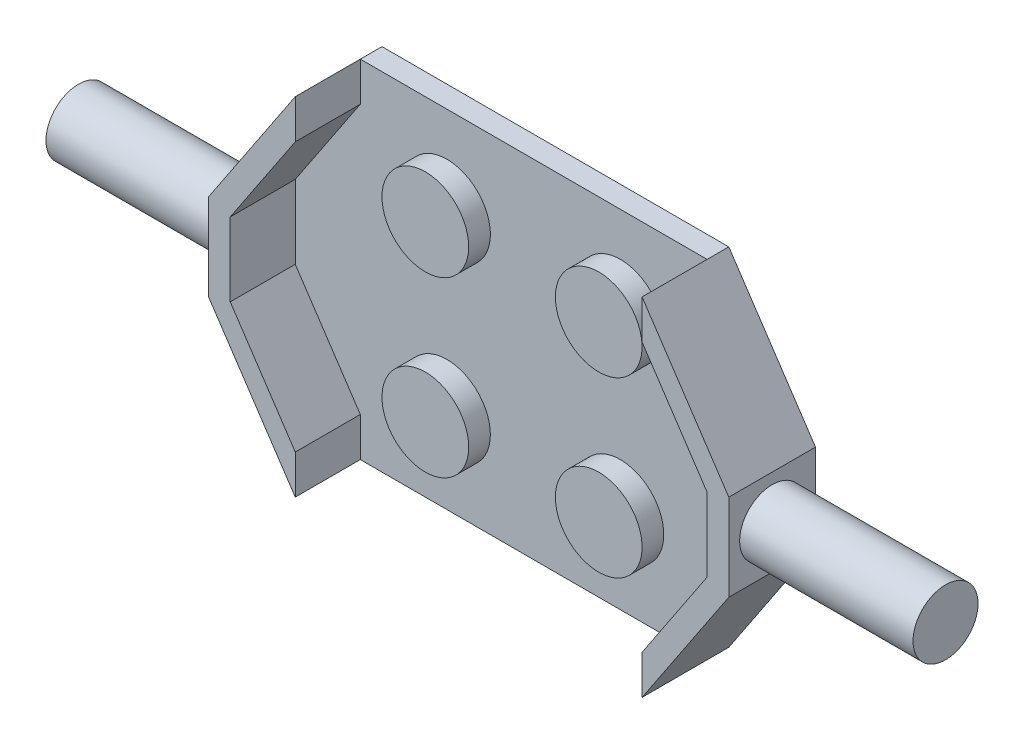
ISO-10303-21;
HEADER;
FILE_DESCRIPTION(('STEP AP214'),'2;1');
FILE_NAME('part.step','',(''),(''),'','','');
FILE_SCHEMA(('AUTOMOTIVE_DESIGN { 1 0 10303 214 1 1 1 1 }'));
ENDSEC;
DATA;
#1=APPLICATION_CONTEXT('core data for automotive mechanical design processes');
#2=APPLICATION_PROTOCOL_DEFINITION('international standard','automotive_design',2000,#1);
#3=PRODUCT_CONTEXT('',#1,'mechanical');
#4=PRODUCT('Part','Part','',(#3));
#5=PRODUCT_RELATED_PRODUCT_CATEGORY('part','',(#4));
#6=PRODUCT_DEFINITION_FORMATION('','',#4);
#7=PRODUCT_DEFINITION_CONTEXT('part definition',#1,'design');
#8=PRODUCT_DEFINITION('design','',#6,#7);
#9=PRODUCT_DEFINITION_SHAPE('','',#8);
#10=(LENGTH_UNIT() NAMED_UNIT(*) SI_UNIT(.MILLI.,.METRE.));
#11=(NAMED_UNIT(*) PLANE_ANGLE_UNIT() SI_UNIT($,.RADIAN.));
#12=(NAMED_UNIT(*) SI_UNIT($,.STERADIAN.) SOLID_ANGLE_UNIT());
#13=UNCERTAINTY_MEASURE_WITH_UNIT(LENGTH_MEASURE(1.E-05),#10,'distance_accuracy_value','');
#14=(GEOMETRIC_REPRESENTATION_CONTEXT(3) GLOBAL_UNCERTAINTY_ASSIGNED_CONTEXT((#13)) GLOBAL_UNIT_ASSIGNED_CONTEXT((#10,
#11,#12)) REPRESENTATION_CONTEXT('',''));
#15=CARTESIAN_POINT('',(0.,0.,0.));
#16=DIRECTION('',(0.,0.,1.));
#17=DIRECTION('',(1.,0.,0.));
#18=AXIS2_PLACEMENT_3D('',#15,#16,#17);
#19=CARTESIAN_POINT('',(0.,0.,1.));
#20=DIRECTION('',(0.,0.,-1.));
#21=DIRECTION('',(-1.,0.,0.));
#22=AXIS2_PLACEMENT_3D('',#19,#20,#21);
#23=PLANE('',#22);
#24=CARTESIAN_POINT('',(4.,4.,1.));
#25=DIRECTION('',(0.,0.,-1.));
#26=DIRECTION('',(-1.,0.,0.));
#27=AXIS2_PLACEMENT_3D('',#24,#25,#26);
#28=CIRCLE('',#27,2.);
#29=CARTESIAN_POINT('',(2.,4.,1.));
#30=VERTEX_POINT('',#29);
#31=EDGE_CURVE('E230',#30,#30,#28,.T.);
#32=ORIENTED_EDGE('',*,*,#31,.T.);
#33=EDGE_LOOP('',(#32));
#34=FACE_BOUND('',#33,.T.);
#35=CARTESIAN_POINT('',(3.99999999999999,-4.,1.));
#36=DIRECTION('',(0.,0.,-1.));
#37=DIRECTION('',(-1.,0.,0.));
#38=AXIS2_PLACEMENT_3D('',#35,#36,#37);
#39=CIRCLE('',#38,2.);
#40=CARTESIAN_POINT('',(2.,-4.,1.));
#41=VERTEX_POINT('',#40);
#42=EDGE_CURVE('E43',#41,#41,#39,.F.);
#43=ORIENTED_EDGE('',*,*,#42,.F.);
#44=EDGE_LOOP('',(#43));
#45=FACE_BOUND('',#44,.T.);
#46=CARTESIAN_POINT('',(-3.99999999999999,-4.,1.));
#47=DIRECTION('',(0.,0.,1.));
#48=DIRECTION('',(1.,0.,0.));
#49=AXIS2_PLACEMENT_3D('',#46,#47,#48);
#50=CIRCLE('',#49,2.);
#51=CARTESIAN_POINT('',(-2.,-4.,1.));
#52=VERTEX_POINT('',#51);
#53=EDGE_CURVE('E303',#52,#52,#50,.F.);
#54=ORIENTED_EDGE('',*,*,#53,.T.);
#55=EDGE_LOOP('',(#54));
#56=FACE_BOUND('',#55,.T.);
#57=CARTESIAN_POINT('',(-4.,4.,1.));
#58=DIRECTION('',(0.,0.,-1.));
#59=DIRECTION('',(-1.,0.,0.));
#60=AXIS2_PLACEMENT_3D('',#57,#58,#59);
#61=CIRCLE('',#60,2.);
#62=CARTESIAN_POINT('',(-6.,4.,1.));
#63=VERTEX_POINT('',#62);
#64=EDGE_CURVE('E336',#63,#63,#61,.F.);
#65=ORIENTED_EDGE('',*,*,#64,.F.);
#66=EDGE_LOOP('',(#65));
#67=FACE_BOUND('',#66,.T.);
#68=DIRECTION('',(-0.554700196225229,0.832050294337844,0.));
#69=VECTOR('',#68,1.);
#70=CARTESIAN_POINT('',(8.,6.197224362268,1.));
#71=LINE('',#70,#69);
#72=CARTESIAN_POINT('',(11.,1.697224362268,1.));
#73=VERTEX_POINT('',#72);
#74=CARTESIAN_POINT('',(8.,6.197224362268,1.));
#75=VERTEX_POINT('',#74);
#76=EDGE_CURVE('E208',#73,#75,#71,.T.);
#77=ORIENTED_EDGE('',*,*,#76,.T.);
#78=DIRECTION('',(0.,1.,0.));
#79=VECTOR('',#78,1.);
#80=CARTESIAN_POINT('',(8.,8.,1.));
#81=LINE('',#80,#79);
#82=CARTESIAN_POINT('',(8.,8.,1.));
#83=VERTEX_POINT('',#82);
#84=EDGE_CURVE('E205',#75,#83,#81,.T.);
#85=ORIENTED_EDGE('',*,*,#84,.T.);
#86=DIRECTION('',(-1.,0.,0.));
#87=VECTOR('',#86,1.);
#88=CARTESIAN_POINT('',(0.,8.,1.));
#89=LINE('',#88,#87);
#90=CARTESIAN_POINT('',(-8.,8.,1.));
#91=VERTEX_POINT('',#90);
#92=EDGE_CURVE('E310',#83,#91,#89,.T.);
#93=ORIENTED_EDGE('',*,*,#92,.T.);
#94=DIRECTION('',(0.,1.,0.));
#95=VECTOR('',#94,1.);
#96=CARTESIAN_POINT('',(-8.,8.,1.));
#97=LINE('',#96,#95);
#98=CARTESIAN_POINT('',(-8.,6.197224362268,1.));
#99=VERTEX_POINT('',#98);
#100=EDGE_CURVE('E259',#99,#91,#97,.T.);
#101=ORIENTED_EDGE('',*,*,#100,.F.);
#102=DIRECTION('',(0.554700196225229,0.832050294337844,0.));
#103=VECTOR('',#102,1.);
#104=CARTESIAN_POINT('',(-8.,6.197224362268,1.));
#105=LINE('',#104,#103);
#106=CARTESIAN_POINT('',(-11.,1.697224362268,1.));
#107=VERTEX_POINT('',#106);
#108=EDGE_CURVE('E278',#107,#99,#105,.T.);
#109=ORIENTED_EDGE('',*,*,#108,.F.);
#110=DIRECTION('',(0.,1.,0.));
#111=VECTOR('',#110,1.);
#112=CARTESIAN_POINT('',(-11.,1.697224362268,1.));
#113=LINE('',#112,#111);
#114=CARTESIAN_POINT('',(-11.,-1.69722436226801,1.));
#115=VERTEX_POINT('',#114);
#116=EDGE_CURVE('E55',#115,#107,#113,.T.);
#117=ORIENTED_EDGE('',*,*,#116,.F.);
#118=DIRECTION('',(-0.554700196225229,0.832050294337844,0.));
#119=VECTOR('',#118,1.);
#120=CARTESIAN_POINT('',(-11.,-1.69722436226801,1.));
#121=LINE('',#120,#119);
#122=CARTESIAN_POINT('',(-7.99999999999999,-6.19722436226801,1.));
#123=VERTEX_POINT('',#122);
#124=EDGE_CURVE('E50',#123,#115,#121,.T.);
#125=ORIENTED_EDGE('',*,*,#124,.F.);
#126=DIRECTION('',(0.,1.,0.));
#127=VECTOR('',#126,1.);
#128=CARTESIAN_POINT('',(-8.,-6.19722436226801,1.));
#129=LINE('',#128,#127);
#130=CARTESIAN_POINT('',(-8.,-8.,1.));
#131=VERTEX_POINT('',#130);
#132=EDGE_CURVE('E254',#131,#123,#129,.T.);
#133=ORIENTED_EDGE('',*,*,#132,.F.);
#134=DIRECTION('',(1.,0.,0.));
#135=VECTOR('',#134,1.);
#136=CARTESIAN_POINT('',(0.,-8.,1.));
#137=LINE('',#136,#135);
#138=CARTESIAN_POINT('',(8.,-8.,1.));
#139=VERTEX_POINT('',#138);
#140=EDGE_CURVE('E312',#131,#139,#137,.T.);
#141=ORIENTED_EDGE('',*,*,#140,.T.);
#142=DIRECTION('',(0.,1.,0.));
#143=VECTOR('',#142,1.);
#144=CARTESIAN_POINT('',(8.,-6.19722436226801,1.));
#145=LINE('',#144,#143);
#146=CARTESIAN_POINT('',(8.,-6.19722436226801,1.));
#147=VERTEX_POINT('',#146);
#148=EDGE_CURVE('E181',#139,#147,#145,.T.);
#149=ORIENTED_EDGE('',*,*,#148,.T.);
#150=DIRECTION('',(0.554700196225229,0.832050294337844,0.));
#151=VECTOR('',#150,1.);
#152=CARTESIAN_POINT('',(11.,-1.69722436226801,1.));
#153=LINE('',#152,#151);
#154=CARTESIAN_POINT('',(11.,-1.69722436226801,1.));
#155=VERTEX_POINT('',#154);
#156=EDGE_CURVE('E215',#147,#155,#153,.T.);
#157=ORIENTED_EDGE('',*,*,#156,.T.);
#158=DIRECTION('',(0.,1.,0.));
#159=VECTOR('',#158,1.);
#160=CARTESIAN_POINT('',(11.,1.697224362268,1.));
#161=LINE('',#160,#159);
#162=EDGE_CURVE('E212',#155,#73,#161,.T.);
#163=ORIENTED_EDGE('',*,*,#162,.T.);
#164=EDGE_LOOP('',(#77,#85,#93,#101,#109,#117,#125,#133,#141,#149,#157,#163));
#165=FACE_BOUND('',#164,.T.);
#166=ADVANCED_FACE('F35',(#34,#45,#56,#67,#165),#23,.F.);
#167=CARTESIAN_POINT('',(0.,8.,1.));
#168=DIRECTION('',(0.,-1.,0.));
#169=DIRECTION('',(1.,0.,0.));
#170=AXIS2_PLACEMENT_3D('',#167,#168,#169);
#171=PLANE('',#170);
#172=DIRECTION('',(-1.,0.,0.));
#173=VECTOR('',#172,1.);
#174=CARTESIAN_POINT('',(0.,8.,0.));
#175=LINE('',#174,#173);
#176=CARTESIAN_POINT('',(8.,8.,0.));
#177=VERTEX_POINT('',#176);
#178=CARTESIAN_POINT('',(-8.,8.,0.));
#179=VERTEX_POINT('',#178);
#180=EDGE_CURVE('E307',#177,#179,#175,.T.);
#181=ORIENTED_EDGE('',*,*,#180,.T.);
#182=DIRECTION('',(0.,0.,-1.));
#183=VECTOR('',#182,1.);
#184=CARTESIAN_POINT('',(-8.,8.,1.));
#185=LINE('',#184,#183);
#186=EDGE_CURVE('E333',#91,#179,#185,.T.);
#187=ORIENTED_EDGE('',*,*,#186,.F.);
#188=ORIENTED_EDGE('',*,*,#92,.F.);
#189=DIRECTION('',(0.,0.,-1.));
#190=VECTOR('',#189,1.);
#191=CARTESIAN_POINT('',(8.,8.,1.));
#192=LINE('',#191,#190);
#193=EDGE_CURVE('E170',#83,#177,#192,.T.);
#194=ORIENTED_EDGE('',*,*,#193,.T.);
#195=EDGE_LOOP('',(#181,#187,#188,#194));
#196=FACE_BOUND('',#195,.T.);
#197=ADVANCED_FACE('F37',(#196),#171,.F.);
#198=CARTESIAN_POINT('',(-8.,8.,1.));
#199=DIRECTION('',(0.832050294337844,-0.554700196225229,0.));
#200=DIRECTION('',(0.554700196225229,0.832050294337844,0.));
#201=AXIS2_PLACEMENT_3D('',#198,#199,#200);
#202=PLANE('',#201);
#203=DIRECTION('',(-0.554700196225229,-0.832050294337844,0.));
#204=VECTOR('',#203,1.);
#205=CARTESIAN_POINT('',(-8.,8.,0.));
#206=LINE('',#205,#204);
#207=CARTESIAN_POINT('',(-12.,2.,0.));
#208=VERTEX_POINT('',#207);
#209=EDGE_CURVE('E318',#179,#208,#206,.T.);
#210=ORIENTED_EDGE('',*,*,#209,.T.);
#211=DIRECTION('',(0.,0.,-1.));
#212=VECTOR('',#211,1.);
#213=CARTESIAN_POINT('',(-12.,2.,1.));
#214=LINE('',#213,#212);
#215=CARTESIAN_POINT('',(-12.,2.,4.));
#216=VERTEX_POINT('',#215);
#217=EDGE_CURVE('E330',#216,#208,#214,.T.);
#218=ORIENTED_EDGE('',*,*,#217,.F.);
#219=DIRECTION('',(-0.554700196225229,-0.832050294337844,0.));
#220=VECTOR('',#219,1.);
#221=CARTESIAN_POINT('',(-8.,8.,4.));
#222=LINE('',#221,#220);
#223=CARTESIAN_POINT('',(-8.,8.,4.));
#224=VERTEX_POINT('',#223);
#225=EDGE_CURVE('E271',#224,#216,#222,.T.);
#226=ORIENTED_EDGE('',*,*,#225,.F.);
#227=DIRECTION('',(0.,0.,-1.));
#228=VECTOR('',#227,1.);
#229=CARTESIAN_POINT('',(-8.,8.,4.));
#230=LINE('',#229,#228);
#231=EDGE_CURVE('E274',#224,#91,#230,.T.);
#232=ORIENTED_EDGE('',*,*,#231,.T.);
#233=ORIENTED_EDGE('',*,*,#186,.T.);
#234=EDGE_LOOP('',(#210,#218,#226,#232,#233));
#235=FACE_BOUND('',#234,.T.);
#236=ADVANCED_FACE('F419',(#235),#202,.F.);
#237=CARTESIAN_POINT('',(-12.,-2.,1.));
#238=DIRECTION('',(1.,0.,0.));
#239=DIRECTION('',(0.,0.,-1.));
#240=AXIS2_PLACEMENT_3D('',#237,#238,#239);
#241=PLANE('',#240);
#242=CARTESIAN_POINT('',(-12.,0.,2.));
#243=DIRECTION('',(1.,0.,0.));
#244=DIRECTION('',(0.,0.,-1.));
#245=AXIS2_PLACEMENT_3D('',#242,#243,#244);
#246=CIRCLE('',#245,1.5);
#247=CARTESIAN_POINT('',(-12.,0.,0.5));
#248=VERTEX_POINT('',#247);
#249=EDGE_CURVE('E339',#248,#248,#246,.F.);
#250=ORIENTED_EDGE('',*,*,#249,.F.);
#251=EDGE_LOOP('',(#250));
#252=FACE_BOUND('',#251,.T.);
#253=DIRECTION('',(0.,-1.,0.));
#254=VECTOR('',#253,1.);
#255=CARTESIAN_POINT('',(-12.,-2.,0.));
#256=LINE('',#255,#254);
#257=CARTESIAN_POINT('',(-12.,-2.,0.));
#258=VERTEX_POINT('',#257);
#259=EDGE_CURVE('E320',#208,#258,#256,.T.);
#260=ORIENTED_EDGE('',*,*,#259,.T.);
#261=DIRECTION('',(0.,0.,-1.));
#262=VECTOR('',#261,1.);
#263=CARTESIAN_POINT('',(-12.,-2.,1.));
#264=LINE('',#263,#262);
#265=CARTESIAN_POINT('',(-12.,-2.,4.));
#266=VERTEX_POINT('',#265);
#267=EDGE_CURVE('E327',#266,#258,#264,.T.);
#268=ORIENTED_EDGE('',*,*,#267,.F.);
#269=DIRECTION('',(0.,-1.,0.));
#270=VECTOR('',#269,1.);
#271=CARTESIAN_POINT('',(-12.,2.,4.));
#272=LINE('',#271,#270);
#273=EDGE_CURVE('E255',#216,#266,#272,.T.);
#274=ORIENTED_EDGE('',*,*,#273,.F.);
#275=ORIENTED_EDGE('',*,*,#217,.T.);
#276=EDGE_LOOP('',(#260,#268,#274,#275));
#277=FACE_BOUND('',#276,.T.);
#278=ADVANCED_FACE('F417',(#252,#277),#241,.F.);
#279=CARTESIAN_POINT('',(-8.,-8.,1.));
#280=DIRECTION('',(0.832050294337843,0.55470019622523,0.));
#281=DIRECTION('',(-0.55470019622523,0.832050294337843,0.));
#282=AXIS2_PLACEMENT_3D('',#279,#280,#281);
#283=PLANE('',#282);
#284=DIRECTION('',(0.55470019622523,-0.832050294337843,0.));
#285=VECTOR('',#284,1.);
#286=CARTESIAN_POINT('',(-8.,-8.,0.));
#287=LINE('',#286,#285);
#288=CARTESIAN_POINT('',(-8.,-8.,0.));
#289=VERTEX_POINT('',#288);
#290=EDGE_CURVE('E322',#258,#289,#287,.T.);
#291=ORIENTED_EDGE('',*,*,#290,.T.);
#292=DIRECTION('',(0.,0.,-1.));
#293=VECTOR('',#292,1.);
#294=CARTESIAN_POINT('',(-8.,-8.,1.));
#295=LINE('',#294,#293);
#296=EDGE_CURVE('E316',#131,#289,#295,.T.);
#297=ORIENTED_EDGE('',*,*,#296,.F.);
#298=DIRECTION('',(0.,0.,-1.));
#299=VECTOR('',#298,1.);
#300=CARTESIAN_POINT('',(-8.,-8.,4.));
#301=LINE('',#300,#299);
#302=CARTESIAN_POINT('',(-8.,-8.,4.));
#303=VERTEX_POINT('',#302);
#304=EDGE_CURVE('E297',#303,#131,#301,.T.);
#305=ORIENTED_EDGE('',*,*,#304,.F.);
#306=DIRECTION('',(0.55470019622523,-0.832050294337843,0.));
#307=VECTOR('',#306,1.);
#308=CARTESIAN_POINT('',(-12.,-2.,4.));
#309=LINE('',#308,#307);
#310=EDGE_CURVE('E258',#266,#303,#309,.T.);
#311=ORIENTED_EDGE('',*,*,#310,.F.);
#312=ORIENTED_EDGE('',*,*,#267,.T.);
#313=EDGE_LOOP('',(#291,#297,#305,#311,#312));
#314=FACE_BOUND('',#313,.T.);
#315=ADVANCED_FACE('F410',(#314),#283,.F.);
#316=CARTESIAN_POINT('',(0.,-8.,1.));
#317=DIRECTION('',(0.,1.,0.));
#318=DIRECTION('',(0.,0.,1.));
#319=AXIS2_PLACEMENT_3D('',#316,#317,#318);
#320=PLANE('',#319);
#321=DIRECTION('',(1.,0.,0.));
#322=VECTOR('',#321,1.);
#323=CARTESIAN_POINT('',(0.,-8.,0.));
#324=LINE('',#323,#322);
#325=CARTESIAN_POINT('',(8.,-8.,0.));
#326=VERTEX_POINT('',#325);
#327=EDGE_CURVE('E313',#289,#326,#324,.T.);
#328=ORIENTED_EDGE('',*,*,#327,.T.);
#329=DIRECTION('',(0.,0.,-1.));
#330=VECTOR('',#329,1.);
#331=CARTESIAN_POINT('',(8.,-8.,1.));
#332=LINE('',#331,#330);
#333=EDGE_CURVE('E248',#139,#326,#332,.T.);
#334=ORIENTED_EDGE('',*,*,#333,.F.);
#335=ORIENTED_EDGE('',*,*,#140,.F.);
#336=ORIENTED_EDGE('',*,*,#296,.T.);
#337=EDGE_LOOP('',(#328,#334,#335,#336));
#338=FACE_BOUND('',#337,.T.);
#339=ADVANCED_FACE('F414',(#338),#320,.F.);
#340=CARTESIAN_POINT('',(0.,0.,0.));
#341=DIRECTION('',(0.,0.,-1.));
#342=DIRECTION('',(-1.,0.,0.));
#343=AXIS2_PLACEMENT_3D('',#340,#341,#342);
#344=PLANE('',#343);
#345=ORIENTED_EDGE('',*,*,#180,.F.);
#346=DIRECTION('',(0.554700196225229,-0.832050294337844,0.));
#347=VECTOR('',#346,1.);
#348=CARTESIAN_POINT('',(8.,8.,0.));
#349=LINE('',#348,#347);
#350=CARTESIAN_POINT('',(12.,2.,0.));
#351=VERTEX_POINT('',#350);
#352=EDGE_CURVE('E243',#177,#351,#349,.T.);
#353=ORIENTED_EDGE('',*,*,#352,.T.);
#354=DIRECTION('',(0.,-1.,0.));
#355=VECTOR('',#354,1.);
#356=CARTESIAN_POINT('',(12.,-2.,0.));
#357=LINE('',#356,#355);
#358=CARTESIAN_POINT('',(12.,-2.,0.));
#359=VERTEX_POINT('',#358);
#360=EDGE_CURVE('E164',#351,#359,#357,.T.);
#361=ORIENTED_EDGE('',*,*,#360,.T.);
#362=DIRECTION('',(-0.55470019622523,-0.832050294337843,0.));
#363=VECTOR('',#362,1.);
#364=CARTESIAN_POINT('',(8.,-8.,0.));
#365=LINE('',#364,#363);
#366=EDGE_CURVE('E239',#359,#326,#365,.T.);
#367=ORIENTED_EDGE('',*,*,#366,.T.);
#368=ORIENTED_EDGE('',*,*,#327,.F.);
#369=ORIENTED_EDGE('',*,*,#290,.F.);
#370=ORIENTED_EDGE('',*,*,#259,.F.);
#371=ORIENTED_EDGE('',*,*,#209,.F.);
#372=EDGE_LOOP('',(#345,#353,#361,#367,#368,#369,#370,#371));
#373=FACE_BOUND('',#372,.T.);
#374=ADVANCED_FACE('F378',(#373),#344,.T.);
#375=CARTESIAN_POINT('',(-3.99999999999999,-4.,2.));
#376=DIRECTION('',(0.,0.,-1.));
#377=DIRECTION('',(-1.,0.,0.));
#378=AXIS2_PLACEMENT_3D('',#375,#376,#377);
#379=CYLINDRICAL_SURFACE('',#378,2.);
#380=CARTESIAN_POINT('',(-3.99999999999999,-4.,2.));
#381=DIRECTION('',(0.,0.,1.));
#382=DIRECTION('',(1.,0.,0.));
#383=AXIS2_PLACEMENT_3D('',#380,#381,#382);
#384=CIRCLE('',#383,2.);
#385=CARTESIAN_POINT('',(-2.,-4.,2.));
#386=VERTEX_POINT('',#385);
#387=EDGE_CURVE('E304',#386,#386,#384,.F.);
#388=ORIENTED_EDGE('',*,*,#387,.T.);
#389=EDGE_LOOP('',(#388));
#390=FACE_BOUND('',#389,.T.);
#391=ORIENTED_EDGE('',*,*,#53,.F.);
#392=EDGE_LOOP('',(#391));
#393=FACE_BOUND('',#392,.T.);
#394=ADVANCED_FACE('F433',(#390,#393),#379,.T.);
#395=CARTESIAN_POINT('',(0.,0.,2.));
#396=DIRECTION('',(0.,0.,1.));
#397=DIRECTION('',(1.,0.,0.));
#398=AXIS2_PLACEMENT_3D('',#395,#396,#397);
#399=PLANE('',#398);
#400=ORIENTED_EDGE('',*,*,#387,.F.);
#401=EDGE_LOOP('',(#400));
#402=FACE_BOUND('',#401,.T.);
#403=ADVANCED_FACE('F437',(#402),#399,.T.);
#404=CARTESIAN_POINT('',(-4.,4.,2.));
#405=DIRECTION('',(0.,0.,-1.));
#406=DIRECTION('',(-1.,0.,0.));
#407=AXIS2_PLACEMENT_3D('',#404,#405,#406);
#408=CYLINDRICAL_SURFACE('',#407,2.);
#409=CARTESIAN_POINT('',(-4.,4.,2.));
#410=DIRECTION('',(0.,0.,1.));
#411=DIRECTION('',(1.,0.,0.));
#412=AXIS2_PLACEMENT_3D('',#409,#410,#411);
#413=CIRCLE('',#412,2.);
#414=CARTESIAN_POINT('',(-2.,4.,2.));
#415=VERTEX_POINT('',#414);
#416=EDGE_CURVE('E300',#415,#415,#413,.T.);
#417=ORIENTED_EDGE('',*,*,#416,.F.);
#418=EDGE_LOOP('',(#417));
#419=FACE_BOUND('',#418,.T.);
#420=ORIENTED_EDGE('',*,*,#64,.T.);
#421=EDGE_LOOP('',(#420));
#422=FACE_BOUND('',#421,.T.);
#423=ADVANCED_FACE('F441',(#419,#422),#408,.T.);
#424=CARTESIAN_POINT('',(0.,0.,2.));
#425=DIRECTION('',(0.,0.,1.));
#426=DIRECTION('',(1.,0.,0.));
#427=AXIS2_PLACEMENT_3D('',#424,#425,#426);
#428=PLANE('',#427);
#429=ORIENTED_EDGE('',*,*,#416,.T.);
#430=EDGE_LOOP('',(#429));
#431=FACE_BOUND('',#430,.T.);
#432=ADVANCED_FACE('F445',(#431),#428,.T.);
#433=CARTESIAN_POINT('',(-8.,-6.19722436226801,4.));
#434=DIRECTION('',(-1.,0.,0.));
#435=DIRECTION('',(0.,0.,1.));
#436=AXIS2_PLACEMENT_3D('',#433,#434,#435);
#437=PLANE('',#436);
#438=ORIENTED_EDGE('',*,*,#132,.T.);
#439=DIRECTION('',(0.,0.,-1.));
#440=VECTOR('',#439,1.);
#441=CARTESIAN_POINT('',(-8.,-6.19722436226801,4.));
#442=LINE('',#441,#440);
#443=CARTESIAN_POINT('',(-8.,-6.19722436226801,4.));
#444=VERTEX_POINT('',#443);
#445=EDGE_CURVE('E294',#444,#123,#442,.T.);
#446=ORIENTED_EDGE('',*,*,#445,.F.);
#447=DIRECTION('',(0.,1.,0.));
#448=VECTOR('',#447,1.);
#449=CARTESIAN_POINT('',(-8.,-6.19722436226801,4.));
#450=LINE('',#449,#448);
#451=EDGE_CURVE('E261',#303,#444,#450,.T.);
#452=ORIENTED_EDGE('',*,*,#451,.F.);
#453=ORIENTED_EDGE('',*,*,#304,.T.);
#454=EDGE_LOOP('',(#438,#446,#452,#453));
#455=FACE_BOUND('',#454,.T.);
#456=ADVANCED_FACE('F405',(#455),#437,.F.);
#457=CARTESIAN_POINT('',(-11.,-1.69722436226801,4.));
#458=DIRECTION('',(-0.832050294337843,-0.554700196225229,0.));
#459=DIRECTION('',(0.554700196225229,-0.832050294337844,0.));
#460=AXIS2_PLACEMENT_3D('',#457,#458,#459);
#461=PLANE('',#460);
#462=ORIENTED_EDGE('',*,*,#124,.T.);
#463=DIRECTION('',(0.,0.,-1.));
#464=VECTOR('',#463,1.);
#465=CARTESIAN_POINT('',(-11.,-1.69722436226801,4.));
#466=LINE('',#465,#464);
#467=CARTESIAN_POINT('',(-11.,-1.69722436226801,4.));
#468=VERTEX_POINT('',#467);
#469=EDGE_CURVE('E291',#468,#115,#466,.T.);
#470=ORIENTED_EDGE('',*,*,#469,.F.);
#471=DIRECTION('',(-0.554700196225229,0.832050294337844,0.));
#472=VECTOR('',#471,1.);
#473=CARTESIAN_POINT('',(-11.,-1.69722436226801,4.));
#474=LINE('',#473,#472);
#475=EDGE_CURVE('E263',#444,#468,#474,.T.);
#476=ORIENTED_EDGE('',*,*,#475,.F.);
#477=ORIENTED_EDGE('',*,*,#445,.T.);
#478=EDGE_LOOP('',(#462,#470,#476,#477));
#479=FACE_BOUND('',#478,.T.);
#480=ADVANCED_FACE('F401',(#479),#461,.F.);
#481=CARTESIAN_POINT('',(-11.,1.697224362268,4.));
#482=DIRECTION('',(-1.,0.,0.));
#483=DIRECTION('',(0.,0.,1.));
#484=AXIS2_PLACEMENT_3D('',#481,#482,#483);
#485=PLANE('',#484);
#486=ORIENTED_EDGE('',*,*,#116,.T.);
#487=DIRECTION('',(0.,0.,-1.));
#488=VECTOR('',#487,1.);
#489=CARTESIAN_POINT('',(-11.,1.697224362268,4.));
#490=LINE('',#489,#488);
#491=CARTESIAN_POINT('',(-11.,1.697224362268,4.));
#492=VERTEX_POINT('',#491);
#493=EDGE_CURVE('E288',#492,#107,#490,.T.);
#494=ORIENTED_EDGE('',*,*,#493,.F.);
#495=DIRECTION('',(0.,1.,0.));
#496=VECTOR('',#495,1.);
#497=CARTESIAN_POINT('',(-11.,1.697224362268,4.));
#498=LINE('',#497,#496);
#499=EDGE_CURVE('E265',#468,#492,#498,.T.);
#500=ORIENTED_EDGE('',*,*,#499,.F.);
#501=ORIENTED_EDGE('',*,*,#469,.T.);
#502=EDGE_LOOP('',(#486,#494,#500,#501));
#503=FACE_BOUND('',#502,.T.);
#504=ADVANCED_FACE('F399',(#503),#485,.F.);
#505=CARTESIAN_POINT('',(-8.,6.197224362268,4.));
#506=DIRECTION('',(-0.832050294337844,0.554700196225229,0.));
#507=DIRECTION('',(-0.554700196225229,-0.832050294337844,0.));
#508=AXIS2_PLACEMENT_3D('',#505,#506,#507);
#509=PLANE('',#508);
#510=ORIENTED_EDGE('',*,*,#108,.T.);
#511=DIRECTION('',(0.,0.,-1.));
#512=VECTOR('',#511,1.);
#513=CARTESIAN_POINT('',(-8.,6.197224362268,4.));
#514=LINE('',#513,#512);
#515=CARTESIAN_POINT('',(-8.,6.197224362268,4.));
#516=VERTEX_POINT('',#515);
#517=EDGE_CURVE('E285',#516,#99,#514,.T.);
#518=ORIENTED_EDGE('',*,*,#517,.F.);
#519=DIRECTION('',(0.554700196225229,0.832050294337844,0.));
#520=VECTOR('',#519,1.);
#521=CARTESIAN_POINT('',(-8.,6.197224362268,4.));
#522=LINE('',#521,#520);
#523=EDGE_CURVE('E267',#492,#516,#522,.T.);
#524=ORIENTED_EDGE('',*,*,#523,.F.);
#525=ORIENTED_EDGE('',*,*,#493,.T.);
#526=EDGE_LOOP('',(#510,#518,#524,#525));
#527=FACE_BOUND('',#526,.T.);
#528=ADVANCED_FACE('F386',(#527),#509,.F.);
#529=CARTESIAN_POINT('',(-8.,8.,4.));
#530=DIRECTION('',(-1.,0.,0.));
#531=DIRECTION('',(0.,0.,1.));
#532=AXIS2_PLACEMENT_3D('',#529,#530,#531);
#533=PLANE('',#532);
#534=ORIENTED_EDGE('',*,*,#100,.T.);
#535=ORIENTED_EDGE('',*,*,#231,.F.);
#536=DIRECTION('',(0.,1.,0.));
#537=VECTOR('',#536,1.);
#538=CARTESIAN_POINT('',(-8.,8.,4.));
#539=LINE('',#538,#537);
#540=EDGE_CURVE('E269',#516,#224,#539,.T.);
#541=ORIENTED_EDGE('',*,*,#540,.F.);
#542=ORIENTED_EDGE('',*,*,#517,.T.);
#543=EDGE_LOOP('',(#534,#535,#541,#542));
#544=FACE_BOUND('',#543,.T.);
#545=ADVANCED_FACE('F390',(#544),#533,.F.);
#546=CARTESIAN_POINT('',(0.,0.,4.));
#547=DIRECTION('',(0.,0.,1.));
#548=DIRECTION('',(1.,0.,0.));
#549=AXIS2_PLACEMENT_3D('',#546,#547,#548);
#550=PLANE('',#549);
#551=ORIENTED_EDGE('',*,*,#273,.T.);
#552=ORIENTED_EDGE('',*,*,#310,.T.);
#553=ORIENTED_EDGE('',*,*,#451,.T.);
#554=ORIENTED_EDGE('',*,*,#475,.T.);
#555=ORIENTED_EDGE('',*,*,#499,.T.);
#556=ORIENTED_EDGE('',*,*,#523,.T.);
#557=ORIENTED_EDGE('',*,*,#540,.T.);
#558=ORIENTED_EDGE('',*,*,#225,.T.);
#559=EDGE_LOOP('',(#551,#552,#553,#554,#555,#556,#557,#558));
#560=FACE_BOUND('',#559,.T.);
#561=ADVANCED_FACE('F393',(#560),#550,.T.);
#562=CARTESIAN_POINT('',(-20.,0.,2.));
#563=DIRECTION('',(1.,0.,0.));
#564=DIRECTION('',(0.,0.,-1.));
#565=AXIS2_PLACEMENT_3D('',#562,#563,#564);
#566=CYLINDRICAL_SURFACE('',#565,1.5);
#567=CARTESIAN_POINT('',(-20.,0.,2.));
#568=DIRECTION('',(-1.,0.,0.));
#569=DIRECTION('',(0.,0.,1.));
#570=AXIS2_PLACEMENT_3D('',#567,#568,#569);
#571=CIRCLE('',#570,1.5);
#572=CARTESIAN_POINT('',(-20.,0.,3.5));
#573=VERTEX_POINT('',#572);
#574=EDGE_CURVE('E251',#573,#573,#571,.T.);
#575=ORIENTED_EDGE('',*,*,#574,.F.);
#576=EDGE_LOOP('',(#575));
#577=FACE_BOUND('',#576,.T.);
#578=ORIENTED_EDGE('',*,*,#249,.T.);
#579=EDGE_LOOP('',(#578));
#580=FACE_BOUND('',#579,.T.);
#581=ADVANCED_FACE('F462',(#577,#580),#566,.T.);
#582=CARTESIAN_POINT('',(-20.,0.,2.));
#583=DIRECTION('',(-1.,0.,0.));
#584=DIRECTION('',(0.,0.,1.));
#585=AXIS2_PLACEMENT_3D('',#582,#583,#584);
#586=PLANE('',#585);
#587=ORIENTED_EDGE('',*,*,#574,.T.);
#588=EDGE_LOOP('',(#587));
#589=FACE_BOUND('',#588,.T.);
#590=ADVANCED_FACE('F465',(#589),#586,.T.);
#591=CARTESIAN_POINT('',(8.,-8.,1.));
#592=DIRECTION('',(0.832050294337843,-0.55470019622523,0.));
#593=DIRECTION('',(0.55470019622523,0.832050294337843,0.));
#594=AXIS2_PLACEMENT_3D('',#591,#592,#593);
#595=PLANE('',#594);
#596=ORIENTED_EDGE('',*,*,#366,.F.);
#597=DIRECTION('',(0.,0.,-1.));
#598=VECTOR('',#597,1.);
#599=CARTESIAN_POINT('',(12.,-2.,1.));
#600=LINE('',#599,#598);
#601=CARTESIAN_POINT('',(12.,-2.,4.));
#602=VERTEX_POINT('',#601);
#603=EDGE_CURVE('E169',#602,#359,#600,.T.);
#604=ORIENTED_EDGE('',*,*,#603,.F.);
#605=DIRECTION('',(-0.55470019622523,-0.832050294337843,0.));
#606=VECTOR('',#605,1.);
#607=CARTESIAN_POINT('',(12.,-2.,4.));
#608=LINE('',#607,#606);
#609=CARTESIAN_POINT('',(8.,-8.,4.));
#610=VERTEX_POINT('',#609);
#611=EDGE_CURVE('E180',#602,#610,#608,.T.);
#612=ORIENTED_EDGE('',*,*,#611,.T.);
#613=DIRECTION('',(0.,0.,-1.));
#614=VECTOR('',#613,1.);
#615=CARTESIAN_POINT('',(8.,-8.,4.));
#616=LINE('',#615,#614);
#617=EDGE_CURVE('E204',#610,#139,#616,.T.);
#618=ORIENTED_EDGE('',*,*,#617,.T.);
#619=ORIENTED_EDGE('',*,*,#333,.T.);
#620=EDGE_LOOP('',(#596,#604,#612,#618,#619));
#621=FACE_BOUND('',#620,.T.);
#622=ADVANCED_FACE('F374',(#621),#595,.T.);
#623=CARTESIAN_POINT('',(12.,-2.,1.));
#624=DIRECTION('',(1.,0.,0.));
#625=DIRECTION('',(0.,0.,-1.));
#626=AXIS2_PLACEMENT_3D('',#623,#624,#625);
#627=PLANE('',#626);
#628=CARTESIAN_POINT('',(12.,0.,2.));
#629=DIRECTION('',(1.,0.,0.));
#630=DIRECTION('',(0.,0.,-1.));
#631=AXIS2_PLACEMENT_3D('',#628,#629,#630);
#632=CIRCLE('',#631,1.5);
#633=CARTESIAN_POINT('',(12.,0.,0.5));
#634=VERTEX_POINT('',#633);
#635=EDGE_CURVE('E11',#634,#634,#632,.T.);
#636=ORIENTED_EDGE('',*,*,#635,.F.);
#637=EDGE_LOOP('',(#636));
#638=FACE_BOUND('',#637,.T.);
#639=ORIENTED_EDGE('',*,*,#360,.F.);
#640=DIRECTION('',(0.,0.,-1.));
#641=VECTOR('',#640,1.);
#642=CARTESIAN_POINT('',(12.,2.,1.));
#643=LINE('',#642,#641);
#644=CARTESIAN_POINT('',(12.,2.,4.));
#645=VERTEX_POINT('',#644);
#646=EDGE_CURVE('E158',#645,#351,#643,.T.);
#647=ORIENTED_EDGE('',*,*,#646,.F.);
#648=DIRECTION('',(0.,-1.,0.));
#649=VECTOR('',#648,1.);
#650=CARTESIAN_POINT('',(12.,2.,4.));
#651=LINE('',#650,#649);
#652=EDGE_CURVE('E161',#645,#602,#651,.T.);
#653=ORIENTED_EDGE('',*,*,#652,.T.);
#654=ORIENTED_EDGE('',*,*,#603,.T.);
#655=EDGE_LOOP('',(#639,#647,#653,#654));
#656=FACE_BOUND('',#655,.T.);
#657=ADVANCED_FACE('F160',(#638,#656),#627,.T.);
#658=CARTESIAN_POINT('',(8.,8.,1.));
#659=DIRECTION('',(0.832050294337844,0.554700196225229,0.));
#660=DIRECTION('',(-0.554700196225229,0.832050294337844,0.));
#661=AXIS2_PLACEMENT_3D('',#658,#659,#660);
#662=PLANE('',#661);
#663=ORIENTED_EDGE('',*,*,#352,.F.);
#664=ORIENTED_EDGE('',*,*,#193,.F.);
#665=DIRECTION('',(0.,0.,-1.));
#666=VECTOR('',#665,1.);
#667=CARTESIAN_POINT('',(8.,8.,4.));
#668=LINE('',#667,#666);
#669=CARTESIAN_POINT('',(8.,8.,4.));
#670=VERTEX_POINT('',#669);
#671=EDGE_CURVE('E185',#670,#83,#668,.T.);
#672=ORIENTED_EDGE('',*,*,#671,.F.);
#673=DIRECTION('',(0.554700196225229,-0.832050294337844,0.));
#674=VECTOR('',#673,1.);
#675=CARTESIAN_POINT('',(8.,8.,4.));
#676=LINE('',#675,#674);
#677=EDGE_CURVE('E176',#670,#645,#676,.T.);
#678=ORIENTED_EDGE('',*,*,#677,.T.);
#679=ORIENTED_EDGE('',*,*,#646,.T.);
#680=EDGE_LOOP('',(#663,#664,#672,#678,#679));
#681=FACE_BOUND('',#680,.T.);
#682=ADVANCED_FACE('F183',(#681),#662,.T.);
#683=CARTESIAN_POINT('',(3.99999999999999,-4.,2.));
#684=DIRECTION('',(0.,0.,-1.));
#685=DIRECTION('',(-1.,0.,0.));
#686=AXIS2_PLACEMENT_3D('',#683,#684,#685);
#687=CYLINDRICAL_SURFACE('',#686,2.);
#688=CARTESIAN_POINT('',(3.99999999999999,-4.,2.));
#689=DIRECTION('',(0.,0.,-1.));
#690=DIRECTION('',(-1.,0.,0.));
#691=AXIS2_PLACEMENT_3D('',#688,#689,#690);
#692=CIRCLE('',#691,2.);
#693=CARTESIAN_POINT('',(2.,-4.,2.));
#694=VERTEX_POINT('',#693);
#695=EDGE_CURVE('E234',#694,#694,#692,.F.);
#696=ORIENTED_EDGE('',*,*,#695,.F.);
#697=EDGE_LOOP('',(#696));
#698=FACE_BOUND('',#697,.T.);
#699=ORIENTED_EDGE('',*,*,#42,.T.);
#700=EDGE_LOOP('',(#699));
#701=FACE_BOUND('',#700,.T.);
#702=ADVANCED_FACE('F344',(#698,#701),#687,.T.);
#703=CARTESIAN_POINT('',(0.,0.,2.));
#704=DIRECTION('',(0.,0.,1.));
#705=DIRECTION('',(-1.,0.,0.));
#706=AXIS2_PLACEMENT_3D('',#703,#704,#705);
#707=PLANE('',#706);
#708=ORIENTED_EDGE('',*,*,#695,.T.);
#709=EDGE_LOOP('',(#708));
#710=FACE_BOUND('',#709,.T.);
#711=ADVANCED_FACE('F479',(#710),#707,.T.);
#712=CARTESIAN_POINT('',(4.,4.,2.));
#713=DIRECTION('',(0.,0.,-1.));
#714=DIRECTION('',(-1.,0.,0.));
#715=AXIS2_PLACEMENT_3D('',#712,#713,#714);
#716=CYLINDRICAL_SURFACE('',#715,2.);
#717=CARTESIAN_POINT('',(4.,4.,2.));
#718=DIRECTION('',(0.,0.,-1.));
#719=DIRECTION('',(-1.,0.,0.));
#720=AXIS2_PLACEMENT_3D('',#717,#718,#719);
#721=CIRCLE('',#720,2.);
#722=CARTESIAN_POINT('',(2.,4.,2.));
#723=VERTEX_POINT('',#722);
#724=EDGE_CURVE('E231',#723,#723,#721,.T.);
#725=ORIENTED_EDGE('',*,*,#724,.T.);
#726=EDGE_LOOP('',(#725));
#727=FACE_BOUND('',#726,.T.);
#728=ORIENTED_EDGE('',*,*,#31,.F.);
#729=EDGE_LOOP('',(#728));
#730=FACE_BOUND('',#729,.T.);
#731=ADVANCED_FACE('F483',(#727,#730),#716,.T.);
#732=CARTESIAN_POINT('',(0.,0.,2.));
#733=DIRECTION('',(0.,0.,1.));
#734=DIRECTION('',(-1.,0.,0.));
#735=AXIS2_PLACEMENT_3D('',#732,#733,#734);
#736=PLANE('',#735);
#737=ORIENTED_EDGE('',*,*,#724,.F.);
#738=EDGE_LOOP('',(#737));
#739=FACE_BOUND('',#738,.T.);
#740=ADVANCED_FACE('F487',(#739),#736,.T.);
#741=CARTESIAN_POINT('',(8.,8.,4.));
#742=DIRECTION('',(-1.,0.,0.));
#743=DIRECTION('',(0.,0.,1.));
#744=AXIS2_PLACEMENT_3D('',#741,#742,#743);
#745=PLANE('',#744);
#746=ORIENTED_EDGE('',*,*,#84,.F.);
#747=DIRECTION('',(0.,0.,-1.));
#748=VECTOR('',#747,1.);
#749=CARTESIAN_POINT('',(8.,6.197224362268,4.));
#750=LINE('',#749,#748);
#751=CARTESIAN_POINT('',(8.,6.197224362268,4.));
#752=VERTEX_POINT('',#751);
#753=EDGE_CURVE('E227',#752,#75,#750,.T.);
#754=ORIENTED_EDGE('',*,*,#753,.F.);
#755=DIRECTION('',(0.,1.,0.));
#756=VECTOR('',#755,1.);
#757=CARTESIAN_POINT('',(8.,8.,4.));
#758=LINE('',#757,#756);
#759=EDGE_CURVE('E186',#752,#670,#758,.T.);
#760=ORIENTED_EDGE('',*,*,#759,.T.);
#761=ORIENTED_EDGE('',*,*,#671,.T.);
#762=EDGE_LOOP('',(#746,#754,#760,#761));
#763=FACE_BOUND('',#762,.T.);
#764=ADVANCED_FACE('F361',(#763),#745,.T.);
#765=CARTESIAN_POINT('',(8.,6.197224362268,4.));
#766=DIRECTION('',(-0.832050294337844,-0.554700196225229,0.));
#767=DIRECTION('',(0.554700196225229,-0.832050294337844,0.));
#768=AXIS2_PLACEMENT_3D('',#765,#766,#767);
#769=PLANE('',#768);
#770=ORIENTED_EDGE('',*,*,#76,.F.);
#771=DIRECTION('',(0.,0.,-1.));
#772=VECTOR('',#771,1.);
#773=CARTESIAN_POINT('',(11.,1.697224362268,4.));
#774=LINE('',#773,#772);
#775=CARTESIAN_POINT('',(11.,1.697224362268,4.));
#776=VERTEX_POINT('',#775);
#777=EDGE_CURVE('E225',#776,#73,#774,.T.);
#778=ORIENTED_EDGE('',*,*,#777,.F.);
#779=DIRECTION('',(-0.554700196225229,0.832050294337844,0.));
#780=VECTOR('',#779,1.);
#781=CARTESIAN_POINT('',(8.,6.197224362268,4.));
#782=LINE('',#781,#780);
#783=EDGE_CURVE('E188',#776,#752,#782,.T.);
#784=ORIENTED_EDGE('',*,*,#783,.T.);
#785=ORIENTED_EDGE('',*,*,#753,.T.);
#786=EDGE_LOOP('',(#770,#778,#784,#785));
#787=FACE_BOUND('',#786,.T.);
#788=ADVANCED_FACE('F358',(#787),#769,.T.);
#789=CARTESIAN_POINT('',(11.,1.697224362268,4.));
#790=DIRECTION('',(-1.,0.,0.));
#791=DIRECTION('',(0.,0.,1.));
#792=AXIS2_PLACEMENT_3D('',#789,#790,#791);
#793=PLANE('',#792);
#794=ORIENTED_EDGE('',*,*,#162,.F.);
#795=DIRECTION('',(0.,0.,-1.));
#796=VECTOR('',#795,1.);
#797=CARTESIAN_POINT('',(11.,-1.69722436226801,4.));
#798=LINE('',#797,#796);
#799=CARTESIAN_POINT('',(11.,-1.69722436226801,4.));
#800=VERTEX_POINT('',#799);
#801=EDGE_CURVE('E223',#800,#155,#798,.T.);
#802=ORIENTED_EDGE('',*,*,#801,.F.);
#803=DIRECTION('',(0.,1.,0.));
#804=VECTOR('',#803,1.);
#805=CARTESIAN_POINT('',(11.,1.697224362268,4.));
#806=LINE('',#805,#804);
#807=EDGE_CURVE('E194',#800,#776,#806,.T.);
#808=ORIENTED_EDGE('',*,*,#807,.T.);
#809=ORIENTED_EDGE('',*,*,#777,.T.);
#810=EDGE_LOOP('',(#794,#802,#808,#809));
#811=FACE_BOUND('',#810,.T.);
#812=ADVANCED_FACE('F365',(#811),#793,.T.);
#813=CARTESIAN_POINT('',(11.,-1.69722436226801,4.));
#814=DIRECTION('',(-0.832050294337843,0.554700196225229,0.));
#815=DIRECTION('',(-0.554700196225229,-0.832050294337844,0.));
#816=AXIS2_PLACEMENT_3D('',#813,#814,#815);
#817=PLANE('',#816);
#818=ORIENTED_EDGE('',*,*,#156,.F.);
#819=DIRECTION('',(0.,0.,-1.));
#820=VECTOR('',#819,1.);
#821=CARTESIAN_POINT('',(8.,-6.19722436226801,4.));
#822=LINE('',#821,#820);
#823=CARTESIAN_POINT('',(8.,-6.19722436226801,4.));
#824=VERTEX_POINT('',#823);
#825=EDGE_CURVE('E221',#824,#147,#822,.T.);
#826=ORIENTED_EDGE('',*,*,#825,.F.);
#827=DIRECTION('',(0.554700196225229,0.832050294337844,0.));
#828=VECTOR('',#827,1.);
#829=CARTESIAN_POINT('',(11.,-1.69722436226801,4.));
#830=LINE('',#829,#828);
#831=EDGE_CURVE('E197',#824,#800,#830,.T.);
#832=ORIENTED_EDGE('',*,*,#831,.T.);
#833=ORIENTED_EDGE('',*,*,#801,.T.);
#834=EDGE_LOOP('',(#818,#826,#832,#833));
#835=FACE_BOUND('',#834,.T.);
#836=ADVANCED_FACE('F368',(#835),#817,.T.);
#837=CARTESIAN_POINT('',(8.,-6.19722436226801,4.));
#838=DIRECTION('',(-1.,0.,0.));
#839=DIRECTION('',(0.,0.,1.));
#840=AXIS2_PLACEMENT_3D('',#837,#838,#839);
#841=PLANE('',#840);
#842=ORIENTED_EDGE('',*,*,#148,.F.);
#843=ORIENTED_EDGE('',*,*,#617,.F.);
#844=DIRECTION('',(0.,1.,0.));
#845=VECTOR('',#844,1.);
#846=CARTESIAN_POINT('',(8.,-6.19722436226801,4.));
#847=LINE('',#846,#845);
#848=EDGE_CURVE('E200',#610,#824,#847,.T.);
#849=ORIENTED_EDGE('',*,*,#848,.T.);
#850=ORIENTED_EDGE('',*,*,#825,.T.);
#851=EDGE_LOOP('',(#842,#843,#849,#850));
#852=FACE_BOUND('',#851,.T.);
#853=ADVANCED_FACE('F371',(#852),#841,.T.);
#854=CARTESIAN_POINT('',(0.,0.,4.));
#855=DIRECTION('',(0.,0.,1.));
#856=DIRECTION('',(-1.,0.,0.));
#857=AXIS2_PLACEMENT_3D('',#854,#855,#856);
#858=PLANE('',#857);
#859=ORIENTED_EDGE('',*,*,#652,.F.);
#860=ORIENTED_EDGE('',*,*,#677,.F.);
#861=ORIENTED_EDGE('',*,*,#759,.F.);
#862=ORIENTED_EDGE('',*,*,#783,.F.);
#863=ORIENTED_EDGE('',*,*,#807,.F.);
#864=ORIENTED_EDGE('',*,*,#831,.F.);
#865=ORIENTED_EDGE('',*,*,#848,.F.);
#866=ORIENTED_EDGE('',*,*,#611,.F.);
#867=EDGE_LOOP('',(#859,#860,#861,#862,#863,#864,#865,#866));
#868=FACE_BOUND('',#867,.T.);
#869=ADVANCED_FACE('F174',(#868),#858,.T.);
#870=CARTESIAN_POINT('',(20.,0.,2.));
#871=DIRECTION('',(-1.,0.,0.));
#872=DIRECTION('',(0.,0.,1.));
#873=AXIS2_PLACEMENT_3D('',#870,#871,#872);
#874=CYLINDRICAL_SURFACE('',#873,1.5);
#875=CARTESIAN_POINT('',(20.,0.,2.));
#876=DIRECTION('',(-1.,0.,0.));
#877=DIRECTION('',(0.,0.,1.));
#878=AXIS2_PLACEMENT_3D('',#875,#876,#877);
#879=CIRCLE('',#878,1.5);
#880=CARTESIAN_POINT('',(20.,0.,3.5));
#881=VERTEX_POINT('',#880);
#882=EDGE_CURVE('E209',#881,#881,#879,.T.);
#883=ORIENTED_EDGE('',*,*,#882,.T.);
#884=EDGE_LOOP('',(#883));
#885=FACE_BOUND('',#884,.T.);
#886=ORIENTED_EDGE('',*,*,#635,.T.);
#887=EDGE_LOOP('',(#886));
#888=FACE_BOUND('',#887,.T.);
#889=ADVANCED_FACE('F504',(#885,#888),#874,.T.);
#890=CARTESIAN_POINT('',(20.,0.,2.));
#891=DIRECTION('',(1.,0.,0.));
#892=DIRECTION('',(0.,0.,1.));
#893=AXIS2_PLACEMENT_3D('',#890,#891,#892);
#894=PLANE('',#893);
#895=ORIENTED_EDGE('',*,*,#882,.F.);
#896=EDGE_LOOP('',(#895));
#897=FACE_BOUND('',#896,.T.);
#898=ADVANCED_FACE('F507',(#897),#894,.T.);
#899=CLOSED_SHELL('',(#166,#197,#236,#278,#315,#339,#374,#394,#403,#423,#432,#456,#480,#504,
#528,#545,#561,#581,#590,#622,#657,#682,#702,#711,#731,#740,#764,#788,#812,#836,#853,#869,#889,#898));
#900=MANIFOLD_SOLID_BREP('B2',#899);
#901=ADVANCED_BREP_SHAPE_REPRESENTATION('',(#18,#900),#14);
#902=SHAPE_DEFINITION_REPRESENTATION(#9,#901);
ENDSEC;
END-ISO-10303-21;
